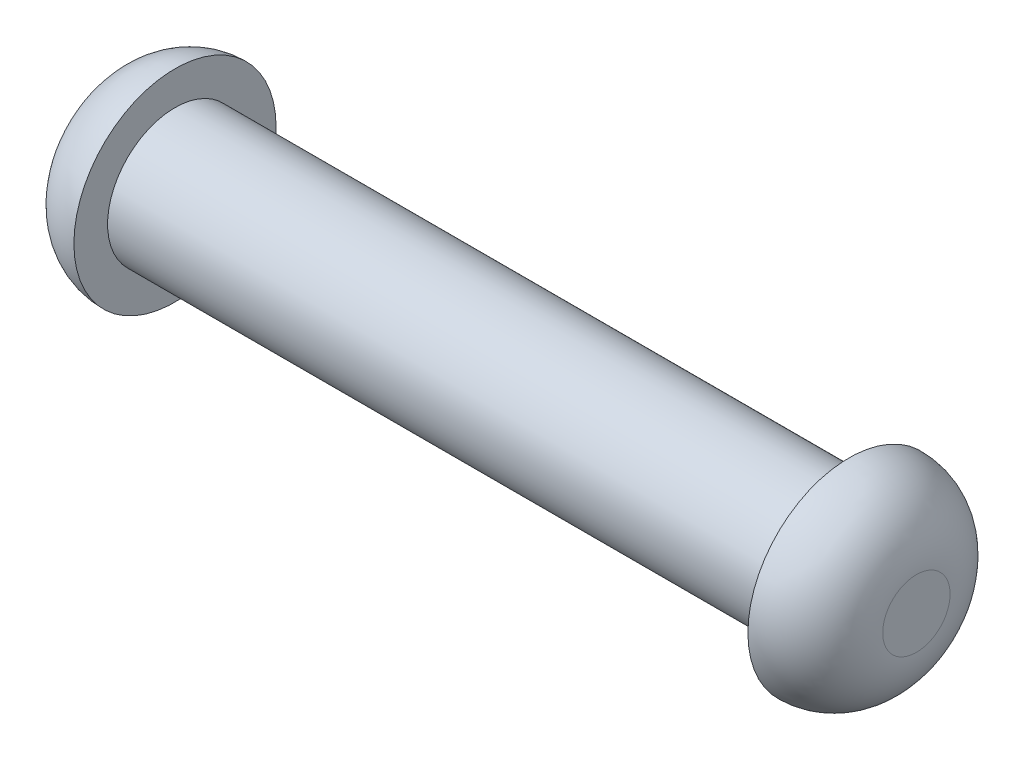
ISO-10303-21;
HEADER;
FILE_DESCRIPTION(('STEP AP214'),'2;1');
FILE_NAME('part.step','',(''),(''),'','','');
FILE_SCHEMA(('AUTOMOTIVE_DESIGN { 1 0 10303 214 1 1 1 1 }'));
ENDSEC;
DATA;
#1=APPLICATION_CONTEXT('core data for automotive mechanical design processes');
#2=APPLICATION_PROTOCOL_DEFINITION('international standard','automotive_design',2000,#1);
#3=PRODUCT_CONTEXT('',#1,'mechanical');
#4=PRODUCT('Part','Part','',(#3));
#5=PRODUCT_RELATED_PRODUCT_CATEGORY('part','',(#4));
#6=PRODUCT_DEFINITION_FORMATION('','',#4);
#7=PRODUCT_DEFINITION_CONTEXT('part definition',#1,'design');
#8=PRODUCT_DEFINITION('design','',#6,#7);
#9=PRODUCT_DEFINITION_SHAPE('','',#8);
#10=(LENGTH_UNIT() NAMED_UNIT(*) SI_UNIT(.MILLI.,.METRE.));
#11=(NAMED_UNIT(*) PLANE_ANGLE_UNIT() SI_UNIT($,.RADIAN.));
#12=(NAMED_UNIT(*) SI_UNIT($,.STERADIAN.) SOLID_ANGLE_UNIT());
#13=UNCERTAINTY_MEASURE_WITH_UNIT(LENGTH_MEASURE(1.E-05),#10,'distance_accuracy_value','');
#14=(GEOMETRIC_REPRESENTATION_CONTEXT(3) GLOBAL_UNCERTAINTY_ASSIGNED_CONTEXT((#13)) GLOBAL_UNIT_ASSIGNED_CONTEXT((#10,
#11,#12)) REPRESENTATION_CONTEXT('',''));
#15=CARTESIAN_POINT('',(0.,0.,0.));
#16=DIRECTION('',(0.,0.,1.));
#17=DIRECTION('',(1.,0.,0.));
#18=AXIS2_PLACEMENT_3D('',#15,#16,#17);
#19=CARTESIAN_POINT('',(0.,1.5,0.));
#20=DIRECTION('',(-1.,0.,0.));
#21=DIRECTION('',(0.,0.,1.));
#22=AXIS2_PLACEMENT_3D('',#19,#20,#21);
#23=PLANE('',#22);
#24=CARTESIAN_POINT('',(0.,0.,0.));
#25=DIRECTION('',(-1.,0.,0.));
#26=DIRECTION('',(0.,0.,1.));
#27=AXIS2_PLACEMENT_3D('',#24,#25,#26);
#28=CIRCLE('',#27,0.5);
#29=CARTESIAN_POINT('',(0.,0.,0.5));
#30=VERTEX_POINT('',#29);
#31=EDGE_CURVE('E44',#30,#30,#28,.T.);
#32=ORIENTED_EDGE('',*,*,#31,.T.);
#33=EDGE_LOOP('',(#32));
#34=FACE_BOUND('',#33,.T.);
#35=ADVANCED_FACE('F37',(#34),#23,.T.);
#36=CARTESIAN_POINT('',(1.,1.,0.));
#37=DIRECTION('',(1.,0.,0.));
#38=DIRECTION('',(0.,0.,-1.));
#39=AXIS2_PLACEMENT_3D('',#36,#37,#38);
#40=PLANE('',#39);
#41=CARTESIAN_POINT('',(1.,0.,0.));
#42=DIRECTION('',(1.,0.,0.));
#43=DIRECTION('',(0.,0.,-1.));
#44=AXIS2_PLACEMENT_3D('',#41,#42,#43);
#45=CIRCLE('',#44,1.5);
#46=CARTESIAN_POINT('',(1.,0.,-1.5));
#47=VERTEX_POINT('',#46);
#48=EDGE_CURVE('E48',#47,#47,#45,.T.);
#49=ORIENTED_EDGE('',*,*,#48,.T.);
#50=EDGE_LOOP('',(#49));
#51=FACE_BOUND('',#50,.T.);
#52=CARTESIAN_POINT('',(1.,0.,0.));
#53=DIRECTION('',(1.,0.,0.));
#54=DIRECTION('',(0.,0.,-1.));
#55=AXIS2_PLACEMENT_3D('',#52,#53,#54);
#56=CIRCLE('',#55,1.);
#57=CARTESIAN_POINT('',(1.,0.,-1.));
#58=VERTEX_POINT('',#57);
#59=EDGE_CURVE('E52',#58,#58,#56,.T.);
#60=ORIENTED_EDGE('',*,*,#59,.F.);
#61=EDGE_LOOP('',(#60));
#62=FACE_BOUND('',#61,.T.);
#63=ADVANCED_FACE('F79',(#51,#62),#40,.T.);
#64=CARTESIAN_POINT('',(12.,0.,0.));
#65=DIRECTION('',(1.,0.,0.));
#66=DIRECTION('',(0.,0.,-1.));
#67=AXIS2_PLACEMENT_3D('',#64,#65,#66);
#68=CYLINDRICAL_SURFACE('',#67,1.);
#69=ORIENTED_EDGE('',*,*,#59,.T.);
#70=EDGE_LOOP('',(#69));
#71=FACE_BOUND('',#70,.T.);
#72=CARTESIAN_POINT('',(11.,0.,0.));
#73=DIRECTION('',(1.,0.,0.));
#74=DIRECTION('',(0.,0.,-1.));
#75=AXIS2_PLACEMENT_3D('',#72,#73,#74);
#76=CIRCLE('',#75,1.);
#77=CARTESIAN_POINT('',(11.,0.,-1.));
#78=VERTEX_POINT('',#77);
#79=EDGE_CURVE('E57',#78,#78,#76,.T.);
#80=ORIENTED_EDGE('',*,*,#79,.F.);
#81=EDGE_LOOP('',(#80));
#82=FACE_BOUND('',#81,.T.);
#83=ADVANCED_FACE('F69',(#71,#82),#68,.T.);
#84=CARTESIAN_POINT('',(11.,1.,0.));
#85=DIRECTION('',(-1.,0.,0.));
#86=DIRECTION('',(0.,0.,1.));
#87=AXIS2_PLACEMENT_3D('',#84,#85,#86);
#88=PLANE('',#87);
#89=ORIENTED_EDGE('',*,*,#79,.T.);
#90=EDGE_LOOP('',(#89));
#91=FACE_BOUND('',#90,.T.);
#92=CARTESIAN_POINT('',(11.,0.,0.));
#93=DIRECTION('',(1.,0.,0.));
#94=DIRECTION('',(0.,0.,-1.));
#95=AXIS2_PLACEMENT_3D('',#92,#93,#94);
#96=CIRCLE('',#95,1.5);
#97=CARTESIAN_POINT('',(11.,0.,-1.5));
#98=VERTEX_POINT('',#97);
#99=EDGE_CURVE('E60',#98,#98,#96,.T.);
#100=ORIENTED_EDGE('',*,*,#99,.F.);
#101=EDGE_LOOP('',(#100));
#102=FACE_BOUND('',#101,.T.);
#103=ADVANCED_FACE('F66',(#91,#102),#88,.T.);
#104=CARTESIAN_POINT('',(12.,1.5,0.));
#105=DIRECTION('',(1.,0.,0.));
#106=DIRECTION('',(0.,0.,-1.));
#107=AXIS2_PLACEMENT_3D('',#104,#105,#106);
#108=PLANE('',#107);
#109=CARTESIAN_POINT('',(12.,0.,0.));
#110=DIRECTION('',(1.,0.,0.));
#111=DIRECTION('',(0.,0.,-1.));
#112=AXIS2_PLACEMENT_3D('',#109,#110,#111);
#113=CIRCLE('',#112,0.5);
#114=CARTESIAN_POINT('',(12.,0.,-0.5));
#115=VERTEX_POINT('',#114);
#116=EDGE_CURVE('E10',#115,#115,#113,.T.);
#117=ORIENTED_EDGE('',*,*,#116,.T.);
#118=EDGE_LOOP('',(#117));
#119=FACE_BOUND('',#118,.T.);
#120=ADVANCED_FACE('F68',(#119),#108,.T.);
#121=CARTESIAN_POINT('',(1.,0.,0.));
#122=DIRECTION('',(-1.,0.,0.));
#123=DIRECTION('',(0.,0.,1.));
#124=AXIS2_PLACEMENT_3D('',#121,#122,#123);
#125=DEGENERATE_TOROIDAL_SURFACE('',#124,0.5,1.,.T.);
#126=ORIENTED_EDGE('',*,*,#31,.F.);
#127=EDGE_LOOP('',(#126));
#128=FACE_BOUND('',#127,.T.);
#129=ORIENTED_EDGE('',*,*,#48,.F.);
#130=EDGE_LOOP('',(#129));
#131=FACE_BOUND('',#130,.T.);
#132=ADVANCED_FACE('F77',(#128,#131),#125,.T.);
#133=CARTESIAN_POINT('',(11.,0.,0.));
#134=DIRECTION('',(1.,0.,0.));
#135=DIRECTION('',(0.,0.,-1.));
#136=AXIS2_PLACEMENT_3D('',#133,#134,#135);
#137=DEGENERATE_TOROIDAL_SURFACE('',#136,0.5,1.,.T.);
#138=ORIENTED_EDGE('',*,*,#99,.T.);
#139=EDGE_LOOP('',(#138));
#140=FACE_BOUND('',#139,.T.);
#141=ORIENTED_EDGE('',*,*,#116,.F.);
#142=EDGE_LOOP('',(#141));
#143=FACE_BOUND('',#142,.T.);
#144=ADVANCED_FACE('F39',(#140,#143),#137,.T.);
#145=CLOSED_SHELL('',(#35,#63,#83,#103,#120,#132,#144));
#146=MANIFOLD_SOLID_BREP('B2',#145);
#147=ADVANCED_BREP_SHAPE_REPRESENTATION('',(#18,#146),#14);
#148=SHAPE_DEFINITION_REPRESENTATION(#9,#147);
ENDSEC;
END-ISO-10303-21;
